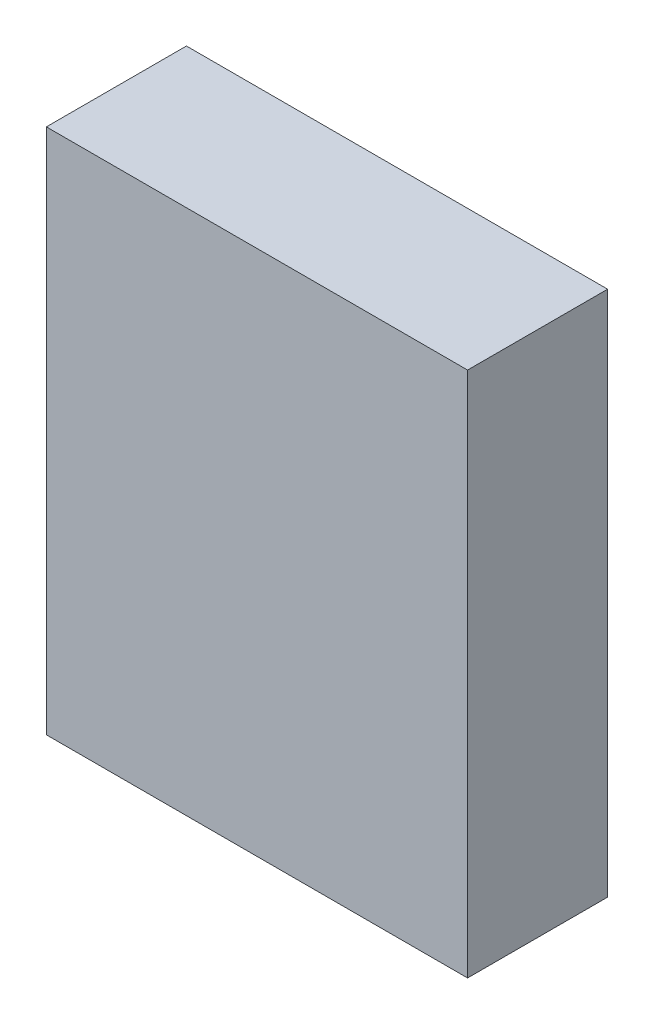
ISO-10303-21;
HEADER;
FILE_DESCRIPTION(('STEP AP214'),'2;1');
FILE_NAME('part.step','',(''),(''),'','','');
FILE_SCHEMA(('AUTOMOTIVE_DESIGN { 1 0 10303 214 1 1 1 1 }'));
ENDSEC;
DATA;
#1=APPLICATION_CONTEXT('core data for automotive mechanical design processes');
#2=APPLICATION_PROTOCOL_DEFINITION('international standard','automotive_design',2000,#1);
#3=PRODUCT_CONTEXT('',#1,'mechanical');
#4=PRODUCT('Part','Part','',(#3));
#5=PRODUCT_RELATED_PRODUCT_CATEGORY('part','',(#4));
#6=PRODUCT_DEFINITION_FORMATION('','',#4);
#7=PRODUCT_DEFINITION_CONTEXT('part definition',#1,'design');
#8=PRODUCT_DEFINITION('design','',#6,#7);
#9=PRODUCT_DEFINITION_SHAPE('','',#8);
#10=(LENGTH_UNIT() NAMED_UNIT(*) SI_UNIT(.MILLI.,.METRE.));
#11=(NAMED_UNIT(*) PLANE_ANGLE_UNIT() SI_UNIT($,.RADIAN.));
#12=(NAMED_UNIT(*) SI_UNIT($,.STERADIAN.) SOLID_ANGLE_UNIT());
#13=UNCERTAINTY_MEASURE_WITH_UNIT(LENGTH_MEASURE(1.E-05),#10,'distance_accuracy_value','');
#14=(GEOMETRIC_REPRESENTATION_CONTEXT(3) GLOBAL_UNCERTAINTY_ASSIGNED_CONTEXT((#13)) GLOBAL_UNIT_ASSIGNED_CONTEXT((#10,
#11,#12)) REPRESENTATION_CONTEXT('',''));
#15=CARTESIAN_POINT('',(0.,0.,0.));
#16=DIRECTION('',(0.,0.,1.));
#17=DIRECTION('',(1.,0.,0.));
#18=AXIS2_PLACEMENT_3D('',#15,#16,#17);
#19=CARTESIAN_POINT('',(0.,0.,0.));
#20=DIRECTION('',(0.,0.,1.));
#21=DIRECTION('',(1.,0.,0.));
#22=AXIS2_PLACEMENT_3D('',#19,#20,#21);
#23=PLANE('',#22);
#24=DIRECTION('',(0.,-1.,0.));
#25=VECTOR('',#24,1.);
#26=CARTESIAN_POINT('',(177.5,-230.,0.));
#27=LINE('',#26,#25);
#28=CARTESIAN_POINT('',(177.5,230.,0.));
#29=VERTEX_POINT('',#28);
#30=CARTESIAN_POINT('',(177.5,-230.,0.));
#31=VERTEX_POINT('',#30);
#32=EDGE_CURVE('E236',#29,#31,#27,.T.);
#33=ORIENTED_EDGE('',*,*,#32,.T.);
#34=DIRECTION('',(-1.,0.,0.));
#35=VECTOR('',#34,1.);
#36=CARTESIAN_POINT('',(-177.5,-230.,0.));
#37=LINE('',#36,#35);
#38=CARTESIAN_POINT('',(-177.5,-230.,0.));
#39=VERTEX_POINT('',#38);
#40=EDGE_CURVE('E239',#31,#39,#37,.T.);
#41=ORIENTED_EDGE('',*,*,#40,.T.);
#42=DIRECTION('',(0.,1.,0.));
#43=VECTOR('',#42,1.);
#44=CARTESIAN_POINT('',(-177.5,-230.,0.));
#45=LINE('',#44,#43);
#46=CARTESIAN_POINT('',(-177.5,230.,0.));
#47=VERTEX_POINT('',#46);
#48=EDGE_CURVE('E242',#39,#47,#45,.T.);
#49=ORIENTED_EDGE('',*,*,#48,.T.);
#50=DIRECTION('',(1.,0.,0.));
#51=VECTOR('',#50,1.);
#52=CARTESIAN_POINT('',(-177.5,230.,0.));
#53=LINE('',#52,#51);
#54=EDGE_CURVE('E226',#47,#29,#53,.T.);
#55=ORIENTED_EDGE('',*,*,#54,.T.);
#56=EDGE_LOOP('',(#33,#41,#49,#55));
#57=FACE_BOUND('',#56,.T.);
#58=DIRECTION('',(0.,-1.,0.));
#59=VECTOR('',#58,1.);
#60=CARTESIAN_POINT('',(176.,-230.,0.));
#61=LINE('',#60,#59);
#62=CARTESIAN_POINT('',(176.,228.5,0.));
#63=VERTEX_POINT('',#62);
#64=CARTESIAN_POINT('',(176.,-228.5,0.));
#65=VERTEX_POINT('',#64);
#66=EDGE_CURVE('E212',#63,#65,#61,.T.);
#67=ORIENTED_EDGE('',*,*,#66,.F.);
#68=DIRECTION('',(1.,0.,0.));
#69=VECTOR('',#68,1.);
#70=CARTESIAN_POINT('',(-177.5,228.5,0.));
#71=LINE('',#70,#69);
#72=CARTESIAN_POINT('',(-176.,228.5,0.));
#73=VERTEX_POINT('',#72);
#74=EDGE_CURVE('E205',#73,#63,#71,.T.);
#75=ORIENTED_EDGE('',*,*,#74,.F.);
#76=DIRECTION('',(0.,1.,0.));
#77=VECTOR('',#76,1.);
#78=CARTESIAN_POINT('',(-176.,-230.,0.));
#79=LINE('',#78,#77);
#80=CARTESIAN_POINT('',(-176.,-228.5,0.));
#81=VERTEX_POINT('',#80);
#82=EDGE_CURVE('E51',#81,#73,#79,.T.);
#83=ORIENTED_EDGE('',*,*,#82,.F.);
#84=DIRECTION('',(-1.,0.,0.));
#85=VECTOR('',#84,1.);
#86=CARTESIAN_POINT('',(-177.5,-228.5,0.));
#87=LINE('',#86,#85);
#88=EDGE_CURVE('E215',#65,#81,#87,.T.);
#89=ORIENTED_EDGE('',*,*,#88,.F.);
#90=EDGE_LOOP('',(#67,#75,#83,#89));
#91=FACE_BOUND('',#90,.T.);
#92=ADVANCED_FACE('F36',(#57,#91),#23,.F.);
#93=CARTESIAN_POINT('',(-200.,-250.,150.));
#94=DIRECTION('',(1.,0.,0.));
#95=DIRECTION('',(0.,0.,-1.));
#96=AXIS2_PLACEMENT_3D('',#93,#94,#95);
#97=PLANE('',#96);
#98=DIRECTION('',(0.,1.,0.));
#99=VECTOR('',#98,1.);
#100=CARTESIAN_POINT('',(-200.,-250.,17.));
#101=LINE('',#100,#99);
#102=CARTESIAN_POINT('',(-200.,-250.,17.));
#103=VERTEX_POINT('',#102);
#104=CARTESIAN_POINT('',(-200.,250.,17.));
#105=VERTEX_POINT('',#104);
#106=EDGE_CURVE('E59',#103,#105,#101,.T.);
#107=ORIENTED_EDGE('',*,*,#106,.F.);
#108=DIRECTION('',(0.,0.,-1.));
#109=VECTOR('',#108,1.);
#110=CARTESIAN_POINT('',(-200.,-250.,150.));
#111=LINE('',#110,#109);
#112=CARTESIAN_POINT('',(-200.,-250.,150.));
#113=VERTEX_POINT('',#112);
#114=EDGE_CURVE('E280',#113,#103,#111,.T.);
#115=ORIENTED_EDGE('',*,*,#114,.F.);
#116=DIRECTION('',(0.,-1.,0.));
#117=VECTOR('',#116,1.);
#118=CARTESIAN_POINT('',(-200.,-250.,150.));
#119=LINE('',#118,#117);
#120=CARTESIAN_POINT('',(-200.,250.,150.));
#121=VERTEX_POINT('',#120);
#122=EDGE_CURVE('E262',#121,#113,#119,.T.);
#123=ORIENTED_EDGE('',*,*,#122,.F.);
#124=DIRECTION('',(0.,0.,-1.));
#125=VECTOR('',#124,1.);
#126=CARTESIAN_POINT('',(-200.,250.,150.));
#127=LINE('',#126,#125);
#128=EDGE_CURVE('E271',#121,#105,#127,.T.);
#129=ORIENTED_EDGE('',*,*,#128,.T.);
#130=EDGE_LOOP('',(#107,#115,#123,#129));
#131=FACE_BOUND('',#130,.T.);
#132=ADVANCED_FACE('F38',(#131),#97,.F.);
#133=CARTESIAN_POINT('',(200.,-250.,150.));
#134=DIRECTION('',(0.,1.,0.));
#135=DIRECTION('',(0.,0.,1.));
#136=AXIS2_PLACEMENT_3D('',#133,#134,#135);
#137=PLANE('',#136);
#138=DIRECTION('',(-1.,0.,0.));
#139=VECTOR('',#138,1.);
#140=CARTESIAN_POINT('',(200.,-250.,17.));
#141=LINE('',#140,#139);
#142=CARTESIAN_POINT('',(200.,-250.,17.));
#143=VERTEX_POINT('',#142);
#144=EDGE_CURVE('E249',#143,#103,#141,.T.);
#145=ORIENTED_EDGE('',*,*,#144,.F.);
#146=DIRECTION('',(0.,0.,-1.));
#147=VECTOR('',#146,1.);
#148=CARTESIAN_POINT('',(200.,-250.,150.));
#149=LINE('',#148,#147);
#150=CARTESIAN_POINT('',(200.,-250.,150.));
#151=VERTEX_POINT('',#150);
#152=EDGE_CURVE('E277',#151,#143,#149,.T.);
#153=ORIENTED_EDGE('',*,*,#152,.F.);
#154=DIRECTION('',(1.,0.,0.));
#155=VECTOR('',#154,1.);
#156=CARTESIAN_POINT('',(200.,-250.,150.));
#157=LINE('',#156,#155);
#158=EDGE_CURVE('E265',#113,#151,#157,.T.);
#159=ORIENTED_EDGE('',*,*,#158,.F.);
#160=ORIENTED_EDGE('',*,*,#114,.T.);
#161=EDGE_LOOP('',(#145,#153,#159,#160));
#162=FACE_BOUND('',#161,.T.);
#163=ADVANCED_FACE('F342',(#162),#137,.F.);
#164=CARTESIAN_POINT('',(200.,-250.,150.));
#165=DIRECTION('',(-1.,0.,0.));
#166=DIRECTION('',(0.,0.,1.));
#167=AXIS2_PLACEMENT_3D('',#164,#165,#166);
#168=PLANE('',#167);
#169=DIRECTION('',(0.,-1.,0.));
#170=VECTOR('',#169,1.);
#171=CARTESIAN_POINT('',(200.,250.,17.));
#172=LINE('',#171,#170);
#173=CARTESIAN_POINT('',(200.,250.,17.));
#174=VERTEX_POINT('',#173);
#175=EDGE_CURVE('E260',#174,#143,#172,.T.);
#176=ORIENTED_EDGE('',*,*,#175,.F.);
#177=DIRECTION('',(0.,0.,-1.));
#178=VECTOR('',#177,1.);
#179=CARTESIAN_POINT('',(200.,250.,150.));
#180=LINE('',#179,#178);
#181=CARTESIAN_POINT('',(200.,250.,150.));
#182=VERTEX_POINT('',#181);
#183=EDGE_CURVE('E274',#182,#174,#180,.T.);
#184=ORIENTED_EDGE('',*,*,#183,.F.);
#185=DIRECTION('',(0.,1.,0.));
#186=VECTOR('',#185,1.);
#187=CARTESIAN_POINT('',(200.,-250.,150.));
#188=LINE('',#187,#186);
#189=EDGE_CURVE('E267',#151,#182,#188,.T.);
#190=ORIENTED_EDGE('',*,*,#189,.F.);
#191=ORIENTED_EDGE('',*,*,#152,.T.);
#192=EDGE_LOOP('',(#176,#184,#190,#191));
#193=FACE_BOUND('',#192,.T.);
#194=ADVANCED_FACE('F352',(#193),#168,.F.);
#195=CARTESIAN_POINT('',(200.,250.,150.));
#196=DIRECTION('',(0.,-1.,0.));
#197=DIRECTION('',(0.,0.,-1.));
#198=AXIS2_PLACEMENT_3D('',#195,#196,#197);
#199=PLANE('',#198);
#200=DIRECTION('',(1.,0.,0.));
#201=VECTOR('',#200,1.);
#202=CARTESIAN_POINT('',(-200.,250.,17.));
#203=LINE('',#202,#201);
#204=EDGE_CURVE('E258',#105,#174,#203,.T.);
#205=ORIENTED_EDGE('',*,*,#204,.F.);
#206=ORIENTED_EDGE('',*,*,#128,.F.);
#207=DIRECTION('',(-1.,0.,0.));
#208=VECTOR('',#207,1.);
#209=CARTESIAN_POINT('',(200.,250.,150.));
#210=LINE('',#209,#208);
#211=EDGE_CURVE('E269',#182,#121,#210,.T.);
#212=ORIENTED_EDGE('',*,*,#211,.F.);
#213=ORIENTED_EDGE('',*,*,#183,.T.);
#214=EDGE_LOOP('',(#205,#206,#212,#213));
#215=FACE_BOUND('',#214,.T.);
#216=ADVANCED_FACE('F349',(#215),#199,.F.);
#217=CARTESIAN_POINT('',(0.,0.,150.));
#218=DIRECTION('',(0.,0.,1.));
#219=DIRECTION('',(1.,0.,0.));
#220=AXIS2_PLACEMENT_3D('',#217,#218,#219);
#221=PLANE('',#220);
#222=ORIENTED_EDGE('',*,*,#122,.T.);
#223=ORIENTED_EDGE('',*,*,#158,.T.);
#224=ORIENTED_EDGE('',*,*,#189,.T.);
#225=ORIENTED_EDGE('',*,*,#211,.T.);
#226=EDGE_LOOP('',(#222,#223,#224,#225));
#227=FACE_BOUND('',#226,.T.);
#228=ADVANCED_FACE('F347',(#227),#221,.T.);
#229=CARTESIAN_POINT('',(0.,0.,17.));
#230=DIRECTION('',(0.,0.,-1.));
#231=DIRECTION('',(-1.,0.,0.));
#232=AXIS2_PLACEMENT_3D('',#229,#230,#231);
#233=PLANE('',#232);
#234=DIRECTION('',(1.,0.,0.));
#235=VECTOR('',#234,1.);
#236=CARTESIAN_POINT('',(-177.5,230.,17.));
#237=LINE('',#236,#235);
#238=CARTESIAN_POINT('',(-177.5,230.,17.));
#239=VERTEX_POINT('',#238);
#240=CARTESIAN_POINT('',(177.5,230.,17.));
#241=VERTEX_POINT('',#240);
#242=EDGE_CURVE('E232',#239,#241,#237,.T.);
#243=ORIENTED_EDGE('',*,*,#242,.F.);
#244=DIRECTION('',(0.,1.,0.));
#245=VECTOR('',#244,1.);
#246=CARTESIAN_POINT('',(-177.5,-230.,17.));
#247=LINE('',#246,#245);
#248=CARTESIAN_POINT('',(-177.5,-230.,17.));
#249=VERTEX_POINT('',#248);
#250=EDGE_CURVE('E229',#249,#239,#247,.T.);
#251=ORIENTED_EDGE('',*,*,#250,.F.);
#252=DIRECTION('',(-1.,0.,0.));
#253=VECTOR('',#252,1.);
#254=CARTESIAN_POINT('',(-177.5,-230.,17.));
#255=LINE('',#254,#253);
#256=CARTESIAN_POINT('',(177.5,-230.,17.));
#257=VERTEX_POINT('',#256);
#258=EDGE_CURVE('E225',#257,#249,#255,.T.);
#259=ORIENTED_EDGE('',*,*,#258,.F.);
#260=DIRECTION('',(0.,-1.,0.));
#261=VECTOR('',#260,1.);
#262=CARTESIAN_POINT('',(177.5,-230.,17.));
#263=LINE('',#262,#261);
#264=EDGE_CURVE('E222',#241,#257,#263,.T.);
#265=ORIENTED_EDGE('',*,*,#264,.F.);
#266=EDGE_LOOP('',(#243,#251,#259,#265));
#267=FACE_BOUND('',#266,.T.);
#268=ORIENTED_EDGE('',*,*,#144,.T.);
#269=ORIENTED_EDGE('',*,*,#106,.T.);
#270=ORIENTED_EDGE('',*,*,#204,.T.);
#271=ORIENTED_EDGE('',*,*,#175,.T.);
#272=EDGE_LOOP('',(#268,#269,#270,#271));
#273=FACE_BOUND('',#272,.T.);
#274=ADVANCED_FACE('F370',(#267,#273),#233,.T.);
#275=CARTESIAN_POINT('',(177.5,-230.,17.));
#276=DIRECTION('',(1.,0.,0.));
#277=DIRECTION('',(0.,0.,-1.));
#278=AXIS2_PLACEMENT_3D('',#275,#276,#277);
#279=PLANE('',#278);
#280=ORIENTED_EDGE('',*,*,#32,.F.);
#281=DIRECTION('',(0.,0.,-1.));
#282=VECTOR('',#281,1.);
#283=CARTESIAN_POINT('',(177.5,230.,17.));
#284=LINE('',#283,#282);
#285=EDGE_CURVE('E247',#241,#29,#284,.T.);
#286=ORIENTED_EDGE('',*,*,#285,.F.);
#287=ORIENTED_EDGE('',*,*,#264,.T.);
#288=DIRECTION('',(0.,0.,-1.));
#289=VECTOR('',#288,1.);
#290=CARTESIAN_POINT('',(177.5,-230.,17.));
#291=LINE('',#290,#289);
#292=EDGE_CURVE('E235',#257,#31,#291,.T.);
#293=ORIENTED_EDGE('',*,*,#292,.T.);
#294=EDGE_LOOP('',(#280,#286,#287,#293));
#295=FACE_BOUND('',#294,.T.);
#296=ADVANCED_FACE('F372',(#295),#279,.T.);
#297=CARTESIAN_POINT('',(-177.5,230.,17.));
#298=DIRECTION('',(0.,1.,0.));
#299=DIRECTION('',(-1.,0.,0.));
#300=AXIS2_PLACEMENT_3D('',#297,#298,#299);
#301=PLANE('',#300);
#302=ORIENTED_EDGE('',*,*,#54,.F.);
#303=DIRECTION('',(0.,0.,-1.));
#304=VECTOR('',#303,1.);
#305=CARTESIAN_POINT('',(-177.5,230.,17.));
#306=LINE('',#305,#304);
#307=EDGE_CURVE('E250',#239,#47,#306,.T.);
#308=ORIENTED_EDGE('',*,*,#307,.F.);
#309=ORIENTED_EDGE('',*,*,#242,.T.);
#310=ORIENTED_EDGE('',*,*,#285,.T.);
#311=EDGE_LOOP('',(#302,#308,#309,#310));
#312=FACE_BOUND('',#311,.T.);
#313=ADVANCED_FACE('F378',(#312),#301,.T.);
#314=CARTESIAN_POINT('',(-177.5,-230.,17.));
#315=DIRECTION('',(-1.,0.,0.));
#316=DIRECTION('',(0.,0.,1.));
#317=AXIS2_PLACEMENT_3D('',#314,#315,#316);
#318=PLANE('',#317);
#319=ORIENTED_EDGE('',*,*,#48,.F.);
#320=DIRECTION('',(0.,0.,-1.));
#321=VECTOR('',#320,1.);
#322=CARTESIAN_POINT('',(-177.5,-230.,17.));
#323=LINE('',#322,#321);
#324=EDGE_CURVE('E252',#249,#39,#323,.T.);
#325=ORIENTED_EDGE('',*,*,#324,.F.);
#326=ORIENTED_EDGE('',*,*,#250,.T.);
#327=ORIENTED_EDGE('',*,*,#307,.T.);
#328=EDGE_LOOP('',(#319,#325,#326,#327));
#329=FACE_BOUND('',#328,.T.);
#330=ADVANCED_FACE('F387',(#329),#318,.T.);
#331=CARTESIAN_POINT('',(-177.5,-230.,17.));
#332=DIRECTION('',(0.,-1.,0.));
#333=DIRECTION('',(1.,0.,0.));
#334=AXIS2_PLACEMENT_3D('',#331,#332,#333);
#335=PLANE('',#334);
#336=ORIENTED_EDGE('',*,*,#40,.F.);
#337=ORIENTED_EDGE('',*,*,#292,.F.);
#338=ORIENTED_EDGE('',*,*,#258,.T.);
#339=ORIENTED_EDGE('',*,*,#324,.T.);
#340=EDGE_LOOP('',(#336,#337,#338,#339));
#341=FACE_BOUND('',#340,.T.);
#342=ADVANCED_FACE('F384',(#341),#335,.T.);
#343=CARTESIAN_POINT('',(-198.5,-250.,150.));
#344=DIRECTION('',(1.,0.,0.));
#345=DIRECTION('',(0.,0.,-1.));
#346=AXIS2_PLACEMENT_3D('',#343,#344,#345);
#347=PLANE('',#346);
#348=DIRECTION('',(0.,1.,0.));
#349=VECTOR('',#348,1.);
#350=CARTESIAN_POINT('',(-198.5,-250.,18.5));
#351=LINE('',#350,#349);
#352=CARTESIAN_POINT('',(-198.5,-248.5,18.5));
#353=VERTEX_POINT('',#352);
#354=CARTESIAN_POINT('',(-198.5,248.5,18.5));
#355=VERTEX_POINT('',#354);
#356=EDGE_CURVE('E150',#353,#355,#351,.T.);
#357=ORIENTED_EDGE('',*,*,#356,.T.);
#358=DIRECTION('',(0.,0.,-1.));
#359=VECTOR('',#358,1.);
#360=CARTESIAN_POINT('',(-198.5,248.5,150.));
#361=LINE('',#360,#359);
#362=CARTESIAN_POINT('',(-198.5,248.5,148.5));
#363=VERTEX_POINT('',#362);
#364=EDGE_CURVE('E155',#363,#355,#361,.T.);
#365=ORIENTED_EDGE('',*,*,#364,.F.);
#366=DIRECTION('',(0.,-1.,0.));
#367=VECTOR('',#366,1.);
#368=CARTESIAN_POINT('',(-198.5,-250.,148.5));
#369=LINE('',#368,#367);
#370=CARTESIAN_POINT('',(-198.5,-248.5,148.5));
#371=VERTEX_POINT('',#370);
#372=EDGE_CURVE('E182',#363,#371,#369,.T.);
#373=ORIENTED_EDGE('',*,*,#372,.T.);
#374=DIRECTION('',(0.,0.,-1.));
#375=VECTOR('',#374,1.);
#376=CARTESIAN_POINT('',(-198.5,-248.5,150.));
#377=LINE('',#376,#375);
#378=EDGE_CURVE('E158',#371,#353,#377,.T.);
#379=ORIENTED_EDGE('',*,*,#378,.T.);
#380=EDGE_LOOP('',(#357,#365,#373,#379));
#381=FACE_BOUND('',#380,.T.);
#382=ADVANCED_FACE('F152',(#381),#347,.T.);
#383=CARTESIAN_POINT('',(200.,-248.5,150.));
#384=DIRECTION('',(0.,1.,0.));
#385=DIRECTION('',(0.,0.,1.));
#386=AXIS2_PLACEMENT_3D('',#383,#384,#385);
#387=PLANE('',#386);
#388=DIRECTION('',(-1.,0.,0.));
#389=VECTOR('',#388,1.);
#390=CARTESIAN_POINT('',(200.,-248.5,18.5));
#391=LINE('',#390,#389);
#392=CARTESIAN_POINT('',(198.5,-248.5,18.5));
#393=VERTEX_POINT('',#392);
#394=EDGE_CURVE('E162',#393,#353,#391,.T.);
#395=ORIENTED_EDGE('',*,*,#394,.T.);
#396=ORIENTED_EDGE('',*,*,#378,.F.);
#397=DIRECTION('',(1.,0.,0.));
#398=VECTOR('',#397,1.);
#399=CARTESIAN_POINT('',(200.,-248.5,148.5));
#400=LINE('',#399,#398);
#401=CARTESIAN_POINT('',(198.5,-248.5,148.5));
#402=VERTEX_POINT('',#401);
#403=EDGE_CURVE('E188',#371,#402,#400,.T.);
#404=ORIENTED_EDGE('',*,*,#403,.T.);
#405=DIRECTION('',(0.,0.,-1.));
#406=VECTOR('',#405,1.);
#407=CARTESIAN_POINT('',(198.5,-248.5,150.));
#408=LINE('',#407,#406);
#409=EDGE_CURVE('E176',#402,#393,#408,.T.);
#410=ORIENTED_EDGE('',*,*,#409,.T.);
#411=EDGE_LOOP('',(#395,#396,#404,#410));
#412=FACE_BOUND('',#411,.T.);
#413=ADVANCED_FACE('F304',(#412),#387,.T.);
#414=CARTESIAN_POINT('',(198.5,-250.,150.));
#415=DIRECTION('',(-1.,0.,0.));
#416=DIRECTION('',(0.,0.,1.));
#417=AXIS2_PLACEMENT_3D('',#414,#415,#416);
#418=PLANE('',#417);
#419=DIRECTION('',(0.,-1.,0.));
#420=VECTOR('',#419,1.);
#421=CARTESIAN_POINT('',(198.5,-250.,18.5));
#422=LINE('',#421,#420);
#423=CARTESIAN_POINT('',(198.5,248.5,18.5));
#424=VERTEX_POINT('',#423);
#425=EDGE_CURVE('E166',#424,#393,#422,.T.);
#426=ORIENTED_EDGE('',*,*,#425,.T.);
#427=ORIENTED_EDGE('',*,*,#409,.F.);
#428=DIRECTION('',(0.,1.,0.));
#429=VECTOR('',#428,1.);
#430=CARTESIAN_POINT('',(198.5,-250.,148.5));
#431=LINE('',#430,#429);
#432=CARTESIAN_POINT('',(198.5,248.5,148.5));
#433=VERTEX_POINT('',#432);
#434=EDGE_CURVE('E178',#402,#433,#431,.T.);
#435=ORIENTED_EDGE('',*,*,#434,.T.);
#436=DIRECTION('',(0.,0.,-1.));
#437=VECTOR('',#436,1.);
#438=CARTESIAN_POINT('',(198.5,248.5,150.));
#439=LINE('',#438,#437);
#440=EDGE_CURVE('E174',#433,#424,#439,.T.);
#441=ORIENTED_EDGE('',*,*,#440,.T.);
#442=EDGE_LOOP('',(#426,#427,#435,#441));
#443=FACE_BOUND('',#442,.T.);
#444=ADVANCED_FACE('F416',(#443),#418,.T.);
#445=CARTESIAN_POINT('',(200.,248.5,150.));
#446=DIRECTION('',(0.,-1.,0.));
#447=DIRECTION('',(0.,0.,-1.));
#448=AXIS2_PLACEMENT_3D('',#445,#446,#447);
#449=PLANE('',#448);
#450=DIRECTION('',(1.,0.,0.));
#451=VECTOR('',#450,1.);
#452=CARTESIAN_POINT('',(200.,248.5,18.5));
#453=LINE('',#452,#451);
#454=EDGE_CURVE('E161',#355,#424,#453,.T.);
#455=ORIENTED_EDGE('',*,*,#454,.T.);
#456=ORIENTED_EDGE('',*,*,#440,.F.);
#457=DIRECTION('',(-1.,0.,0.));
#458=VECTOR('',#457,1.);
#459=CARTESIAN_POINT('',(200.,248.5,148.5));
#460=LINE('',#459,#458);
#461=EDGE_CURVE('E173',#433,#363,#460,.T.);
#462=ORIENTED_EDGE('',*,*,#461,.T.);
#463=ORIENTED_EDGE('',*,*,#364,.T.);
#464=EDGE_LOOP('',(#455,#456,#462,#463));
#465=FACE_BOUND('',#464,.T.);
#466=ADVANCED_FACE('F171',(#465),#449,.T.);
#467=CARTESIAN_POINT('',(0.,0.,148.5));
#468=DIRECTION('',(0.,0.,1.));
#469=DIRECTION('',(1.,0.,0.));
#470=AXIS2_PLACEMENT_3D('',#467,#468,#469);
#471=PLANE('',#470);
#472=CARTESIAN_POINT('',(162.5,-202.5,148.5));
#473=DIRECTION('',(0.,0.,1.));
#474=DIRECTION('',(1.,0.,0.));
#475=AXIS2_PLACEMENT_3D('',#472,#473,#474);
#476=CIRCLE('',#475,7.50000000000001);
#477=CARTESIAN_POINT('',(170.,-202.5,148.5));
#478=VERTEX_POINT('',#477);
#479=EDGE_CURVE('E11',#478,#478,#476,.F.);
#480=ORIENTED_EDGE('',*,*,#479,.F.);
#481=EDGE_LOOP('',(#480));
#482=FACE_BOUND('',#481,.T.);
#483=CARTESIAN_POINT('',(-162.5,-202.5,148.5));
#484=DIRECTION('',(0.,0.,1.));
#485=DIRECTION('',(1.,0.,0.));
#486=AXIS2_PLACEMENT_3D('',#483,#484,#485);
#487=CIRCLE('',#486,7.50000000000001);
#488=CARTESIAN_POINT('',(-155.,-202.5,148.5));
#489=VERTEX_POINT('',#488);
#490=EDGE_CURVE('E44',#489,#489,#487,.F.);
#491=ORIENTED_EDGE('',*,*,#490,.F.);
#492=EDGE_LOOP('',(#491));
#493=FACE_BOUND('',#492,.T.);
#494=CARTESIAN_POINT('',(-162.5,202.5,148.5));
#495=DIRECTION('',(0.,0.,1.));
#496=DIRECTION('',(1.,0.,0.));
#497=AXIS2_PLACEMENT_3D('',#494,#495,#496);
#498=CIRCLE('',#497,7.50000000000001);
#499=CARTESIAN_POINT('',(-155.,202.5,148.5));
#500=VERTEX_POINT('',#499);
#501=EDGE_CURVE('E286',#500,#500,#498,.F.);
#502=ORIENTED_EDGE('',*,*,#501,.F.);
#503=EDGE_LOOP('',(#502));
#504=FACE_BOUND('',#503,.T.);
#505=CARTESIAN_POINT('',(162.5,202.5,148.5));
#506=DIRECTION('',(0.,0.,1.));
#507=DIRECTION('',(1.,0.,0.));
#508=AXIS2_PLACEMENT_3D('',#505,#506,#507);
#509=CIRCLE('',#508,7.50000000000001);
#510=CARTESIAN_POINT('',(170.,202.5,148.5));
#511=VERTEX_POINT('',#510);
#512=EDGE_CURVE('E283',#511,#511,#509,.F.);
#513=ORIENTED_EDGE('',*,*,#512,.F.);
#514=EDGE_LOOP('',(#513));
#515=FACE_BOUND('',#514,.T.);
#516=ORIENTED_EDGE('',*,*,#372,.F.);
#517=ORIENTED_EDGE('',*,*,#461,.F.);
#518=ORIENTED_EDGE('',*,*,#434,.F.);
#519=ORIENTED_EDGE('',*,*,#403,.F.);
#520=EDGE_LOOP('',(#516,#517,#518,#519));
#521=FACE_BOUND('',#520,.T.);
#522=ADVANCED_FACE('F293',(#482,#493,#504,#515,#521),#471,.F.);
#523=CARTESIAN_POINT('',(0.,0.,18.5));
#524=DIRECTION('',(0.,0.,-1.));
#525=DIRECTION('',(-1.,0.,0.));
#526=AXIS2_PLACEMENT_3D('',#523,#524,#525);
#527=PLANE('',#526);
#528=DIRECTION('',(1.,0.,0.));
#529=VECTOR('',#528,1.);
#530=CARTESIAN_POINT('',(0.,228.5,18.5));
#531=LINE('',#530,#529);
#532=CARTESIAN_POINT('',(-176.,228.5,18.5));
#533=VERTEX_POINT('',#532);
#534=CARTESIAN_POINT('',(176.,228.5,18.5));
#535=VERTEX_POINT('',#534);
#536=EDGE_CURVE('E192',#533,#535,#531,.T.);
#537=ORIENTED_EDGE('',*,*,#536,.T.);
#538=DIRECTION('',(0.,-1.,0.));
#539=VECTOR('',#538,1.);
#540=CARTESIAN_POINT('',(176.,0.,18.5));
#541=LINE('',#540,#539);
#542=CARTESIAN_POINT('',(176.,-228.5,18.5));
#543=VERTEX_POINT('',#542);
#544=EDGE_CURVE('E202',#535,#543,#541,.T.);
#545=ORIENTED_EDGE('',*,*,#544,.T.);
#546=DIRECTION('',(-1.,0.,0.));
#547=VECTOR('',#546,1.);
#548=CARTESIAN_POINT('',(0.,-228.5,18.5));
#549=LINE('',#548,#547);
#550=CARTESIAN_POINT('',(-176.,-228.5,18.5));
#551=VERTEX_POINT('',#550);
#552=EDGE_CURVE('E199',#543,#551,#549,.T.);
#553=ORIENTED_EDGE('',*,*,#552,.T.);
#554=DIRECTION('',(0.,1.,0.));
#555=VECTOR('',#554,1.);
#556=CARTESIAN_POINT('',(-176.,0.,18.5));
#557=LINE('',#556,#555);
#558=EDGE_CURVE('E196',#551,#533,#557,.T.);
#559=ORIENTED_EDGE('',*,*,#558,.T.);
#560=EDGE_LOOP('',(#537,#545,#553,#559));
#561=FACE_BOUND('',#560,.T.);
#562=ORIENTED_EDGE('',*,*,#394,.F.);
#563=ORIENTED_EDGE('',*,*,#425,.F.);
#564=ORIENTED_EDGE('',*,*,#454,.F.);
#565=ORIENTED_EDGE('',*,*,#356,.F.);
#566=EDGE_LOOP('',(#562,#563,#564,#565));
#567=FACE_BOUND('',#566,.T.);
#568=ADVANCED_FACE('F165',(#561,#567),#527,.F.);
#569=CARTESIAN_POINT('',(176.,-230.,17.));
#570=DIRECTION('',(1.,0.,0.));
#571=DIRECTION('',(0.,0.,-1.));
#572=AXIS2_PLACEMENT_3D('',#569,#570,#571);
#573=PLANE('',#572);
#574=ORIENTED_EDGE('',*,*,#66,.T.);
#575=DIRECTION('',(0.,0.,-1.));
#576=VECTOR('',#575,1.);
#577=CARTESIAN_POINT('',(176.,-228.5,17.));
#578=LINE('',#577,#576);
#579=EDGE_CURVE('E195',#543,#65,#578,.T.);
#580=ORIENTED_EDGE('',*,*,#579,.F.);
#581=ORIENTED_EDGE('',*,*,#544,.F.);
#582=DIRECTION('',(0.,0.,-1.));
#583=VECTOR('',#582,1.);
#584=CARTESIAN_POINT('',(176.,228.5,17.));
#585=LINE('',#584,#583);
#586=EDGE_CURVE('E185',#535,#63,#585,.T.);
#587=ORIENTED_EDGE('',*,*,#586,.T.);
#588=EDGE_LOOP('',(#574,#580,#581,#587));
#589=FACE_BOUND('',#588,.T.);
#590=ADVANCED_FACE('F406',(#589),#573,.F.);
#591=CARTESIAN_POINT('',(-177.5,228.5,17.));
#592=DIRECTION('',(0.,1.,0.));
#593=DIRECTION('',(-1.,0.,0.));
#594=AXIS2_PLACEMENT_3D('',#591,#592,#593);
#595=PLANE('',#594);
#596=ORIENTED_EDGE('',*,*,#74,.T.);
#597=ORIENTED_EDGE('',*,*,#586,.F.);
#598=ORIENTED_EDGE('',*,*,#536,.F.);
#599=DIRECTION('',(0.,0.,-1.));
#600=VECTOR('',#599,1.);
#601=CARTESIAN_POINT('',(-176.,228.5,17.));
#602=LINE('',#601,#600);
#603=EDGE_CURVE('E207',#533,#73,#602,.T.);
#604=ORIENTED_EDGE('',*,*,#603,.T.);
#605=EDGE_LOOP('',(#596,#597,#598,#604));
#606=FACE_BOUND('',#605,.T.);
#607=ADVANCED_FACE('F403',(#606),#595,.F.);
#608=CARTESIAN_POINT('',(-176.,-230.,17.));
#609=DIRECTION('',(-1.,0.,0.));
#610=DIRECTION('',(0.,0.,1.));
#611=AXIS2_PLACEMENT_3D('',#608,#609,#610);
#612=PLANE('',#611);
#613=ORIENTED_EDGE('',*,*,#82,.T.);
#614=ORIENTED_EDGE('',*,*,#603,.F.);
#615=ORIENTED_EDGE('',*,*,#558,.F.);
#616=DIRECTION('',(0.,0.,-1.));
#617=VECTOR('',#616,1.);
#618=CARTESIAN_POINT('',(-176.,-228.5,17.));
#619=LINE('',#618,#617);
#620=EDGE_CURVE('E209',#551,#81,#619,.T.);
#621=ORIENTED_EDGE('',*,*,#620,.T.);
#622=EDGE_LOOP('',(#613,#614,#615,#621));
#623=FACE_BOUND('',#622,.T.);
#624=ADVANCED_FACE('F399',(#623),#612,.F.);
#625=CARTESIAN_POINT('',(-177.5,-228.5,17.));
#626=DIRECTION('',(0.,-1.,0.));
#627=DIRECTION('',(1.,0.,0.));
#628=AXIS2_PLACEMENT_3D('',#625,#626,#627);
#629=PLANE('',#628);
#630=ORIENTED_EDGE('',*,*,#88,.T.);
#631=ORIENTED_EDGE('',*,*,#620,.F.);
#632=ORIENTED_EDGE('',*,*,#552,.F.);
#633=ORIENTED_EDGE('',*,*,#579,.T.);
#634=EDGE_LOOP('',(#630,#631,#632,#633));
#635=FACE_BOUND('',#634,.T.);
#636=ADVANCED_FACE('F395',(#635),#629,.F.);
#637=CARTESIAN_POINT('',(162.5,202.5,134.5));
#638=DIRECTION('',(0.,0.,1.));
#639=DIRECTION('',(1.,0.,0.));
#640=AXIS2_PLACEMENT_3D('',#637,#638,#639);
#641=CYLINDRICAL_SURFACE('',#640,7.50000000000001);
#642=CARTESIAN_POINT('',(162.5,202.5,134.5));
#643=DIRECTION('',(0.,0.,-1.));
#644=DIRECTION('',(-1.,0.,0.));
#645=AXIS2_PLACEMENT_3D('',#642,#643,#644);
#646=CIRCLE('',#645,7.50000000000001);
#647=CARTESIAN_POINT('',(155.,202.5,134.5));
#648=VERTEX_POINT('',#647);
#649=EDGE_CURVE('E216',#648,#648,#646,.T.);
#650=ORIENTED_EDGE('',*,*,#649,.F.);
#651=EDGE_LOOP('',(#650));
#652=FACE_BOUND('',#651,.T.);
#653=ORIENTED_EDGE('',*,*,#512,.T.);
#654=EDGE_LOOP('',(#653));
#655=FACE_BOUND('',#654,.T.);
#656=ADVANCED_FACE('F398',(#652,#655),#641,.T.);
#657=CARTESIAN_POINT('',(162.5,202.5,134.5));
#658=DIRECTION('',(0.,0.,-1.));
#659=DIRECTION('',(-1.,0.,0.));
#660=AXIS2_PLACEMENT_3D('',#657,#658,#659);
#661=PLANE('',#660);
#662=ORIENTED_EDGE('',*,*,#649,.T.);
#663=EDGE_LOOP('',(#662));
#664=FACE_BOUND('',#663,.T.);
#665=ADVANCED_FACE('F425',(#664),#661,.T.);
#666=CARTESIAN_POINT('',(-162.5,202.5,134.5));
#667=DIRECTION('',(0.,0.,1.));
#668=DIRECTION('',(1.,0.,0.));
#669=AXIS2_PLACEMENT_3D('',#666,#667,#668);
#670=CYLINDRICAL_SURFACE('',#669,7.50000000000001);
#671=CARTESIAN_POINT('',(-162.5,202.5,134.5));
#672=DIRECTION('',(0.,0.,-1.));
#673=DIRECTION('',(-1.,0.,0.));
#674=AXIS2_PLACEMENT_3D('',#671,#672,#673);
#675=CIRCLE('',#674,7.50000000000001);
#676=CARTESIAN_POINT('',(-170.,202.5,134.5));
#677=VERTEX_POINT('',#676);
#678=EDGE_CURVE('E309',#677,#677,#675,.T.);
#679=ORIENTED_EDGE('',*,*,#678,.F.);
#680=EDGE_LOOP('',(#679));
#681=FACE_BOUND('',#680,.T.);
#682=ORIENTED_EDGE('',*,*,#501,.T.);
#683=EDGE_LOOP('',(#682));
#684=FACE_BOUND('',#683,.T.);
#685=ADVANCED_FACE('F429',(#681,#684),#670,.T.);
#686=CARTESIAN_POINT('',(-162.5,202.5,134.5));
#687=DIRECTION('',(0.,0.,-1.));
#688=DIRECTION('',(-1.,0.,0.));
#689=AXIS2_PLACEMENT_3D('',#686,#687,#688);
#690=PLANE('',#689);
#691=ORIENTED_EDGE('',*,*,#678,.T.);
#692=EDGE_LOOP('',(#691));
#693=FACE_BOUND('',#692,.T.);
#694=ADVANCED_FACE('F431',(#693),#690,.T.);
#695=CARTESIAN_POINT('',(-162.5,-202.5,134.5));
#696=DIRECTION('',(0.,0.,1.));
#697=DIRECTION('',(1.,0.,0.));
#698=AXIS2_PLACEMENT_3D('',#695,#696,#697);
#699=CYLINDRICAL_SURFACE('',#698,7.50000000000001);
#700=CARTESIAN_POINT('',(-162.5,-202.5,134.5));
#701=DIRECTION('',(0.,0.,-1.));
#702=DIRECTION('',(-1.,0.,0.));
#703=AXIS2_PLACEMENT_3D('',#700,#701,#702);
#704=CIRCLE('',#703,7.50000000000001);
#705=CARTESIAN_POINT('',(-170.,-202.5,134.5));
#706=VERTEX_POINT('',#705);
#707=EDGE_CURVE('E312',#706,#706,#704,.T.);
#708=ORIENTED_EDGE('',*,*,#707,.F.);
#709=EDGE_LOOP('',(#708));
#710=FACE_BOUND('',#709,.T.);
#711=ORIENTED_EDGE('',*,*,#490,.T.);
#712=EDGE_LOOP('',(#711));
#713=FACE_BOUND('',#712,.T.);
#714=ADVANCED_FACE('F291',(#710,#713),#699,.T.);
#715=CARTESIAN_POINT('',(-162.5,-202.5,134.5));
#716=DIRECTION('',(0.,0.,-1.));
#717=DIRECTION('',(-1.,0.,0.));
#718=AXIS2_PLACEMENT_3D('',#715,#716,#717);
#719=PLANE('',#718);
#720=ORIENTED_EDGE('',*,*,#707,.T.);
#721=EDGE_LOOP('',(#720));
#722=FACE_BOUND('',#721,.T.);
#723=ADVANCED_FACE('F324',(#722),#719,.T.);
#724=CARTESIAN_POINT('',(162.5,-202.5,134.5));
#725=DIRECTION('',(0.,0.,1.));
#726=DIRECTION('',(1.,0.,0.));
#727=AXIS2_PLACEMENT_3D('',#724,#725,#726);
#728=CYLINDRICAL_SURFACE('',#727,7.50000000000001);
#729=CARTESIAN_POINT('',(162.5,-202.5,134.5));
#730=DIRECTION('',(0.,0.,-1.));
#731=DIRECTION('',(-1.,0.,0.));
#732=AXIS2_PLACEMENT_3D('',#729,#730,#731);
#733=CIRCLE('',#732,7.50000000000001);
#734=CARTESIAN_POINT('',(155.,-202.5,134.5));
#735=VERTEX_POINT('',#734);
#736=EDGE_CURVE('E315',#735,#735,#733,.T.);
#737=ORIENTED_EDGE('',*,*,#736,.F.);
#738=EDGE_LOOP('',(#737));
#739=FACE_BOUND('',#738,.T.);
#740=ORIENTED_EDGE('',*,*,#479,.T.);
#741=EDGE_LOOP('',(#740));
#742=FACE_BOUND('',#741,.T.);
#743=ADVANCED_FACE('F321',(#739,#742),#728,.T.);
#744=CARTESIAN_POINT('',(162.5,-202.5,134.5));
#745=DIRECTION('',(0.,0.,-1.));
#746=DIRECTION('',(-1.,0.,0.));
#747=AXIS2_PLACEMENT_3D('',#744,#745,#746);
#748=PLANE('',#747);
#749=ORIENTED_EDGE('',*,*,#736,.T.);
#750=EDGE_LOOP('',(#749));
#751=FACE_BOUND('',#750,.T.);
#752=ADVANCED_FACE('F319',(#751),#748,.T.);
#753=CLOSED_SHELL('',(#92,#132,#163,#194,#216,#228,#274,#296,#313,#330,#342,#382,#413,#444,#466,
#522,#568,#590,#607,#624,#636,#656,#665,#685,#694,#714,#723,#743,#752));
#754=MANIFOLD_SOLID_BREP('B2',#753);
#755=ADVANCED_BREP_SHAPE_REPRESENTATION('',(#18,#754),#14);
#756=SHAPE_DEFINITION_REPRESENTATION(#9,#755);
ENDSEC;
END-ISO-10303-21;
